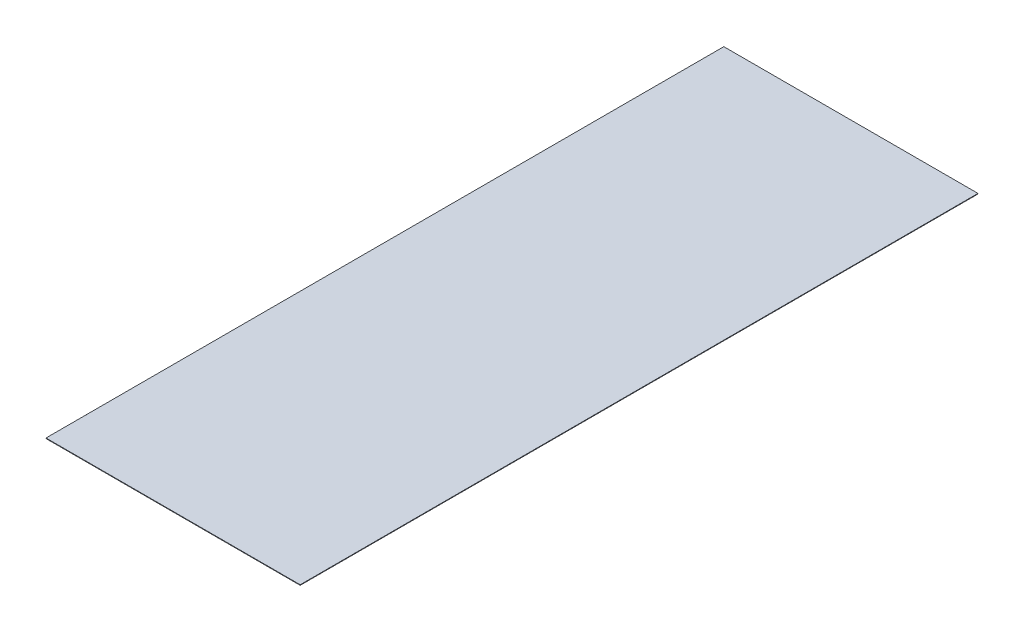
ISO-10303-21;
HEADER;
FILE_DESCRIPTION(('STEP AP214'),'2;1');
FILE_NAME('part.step','',(''),(''),'','','');
FILE_SCHEMA(('AUTOMOTIVE_DESIGN { 1 0 10303 214 1 1 1 1 }'));
ENDSEC;
DATA;
#1=APPLICATION_CONTEXT('core data for automotive mechanical design processes');
#2=APPLICATION_PROTOCOL_DEFINITION('international standard','automotive_design',2000,#1);
#3=PRODUCT_CONTEXT('',#1,'mechanical');
#4=PRODUCT('Part','Part','',(#3));
#5=PRODUCT_RELATED_PRODUCT_CATEGORY('part','',(#4));
#6=PRODUCT_DEFINITION_FORMATION('','',#4);
#7=PRODUCT_DEFINITION_CONTEXT('part definition',#1,'design');
#8=PRODUCT_DEFINITION('design','',#6,#7);
#9=PRODUCT_DEFINITION_SHAPE('','',#8);
#10=(LENGTH_UNIT() NAMED_UNIT(*) SI_UNIT(.MILLI.,.METRE.));
#11=(NAMED_UNIT(*) PLANE_ANGLE_UNIT() SI_UNIT($,.RADIAN.));
#12=(NAMED_UNIT(*) SI_UNIT($,.STERADIAN.) SOLID_ANGLE_UNIT());
#13=UNCERTAINTY_MEASURE_WITH_UNIT(LENGTH_MEASURE(1.E-05),#10,'distance_accuracy_value','');
#14=(GEOMETRIC_REPRESENTATION_CONTEXT(3) GLOBAL_UNCERTAINTY_ASSIGNED_CONTEXT((#13)) GLOBAL_UNIT_ASSIGNED_CONTEXT((#10,
#11,#12)) REPRESENTATION_CONTEXT('',''));
#15=CARTESIAN_POINT('',(0.,0.,0.));
#16=DIRECTION('',(0.,0.,1.));
#17=DIRECTION('',(1.,0.,0.));
#18=AXIS2_PLACEMENT_3D('',#15,#16,#17);
#19=CARTESIAN_POINT('',(457.2,1.9,1219.2));
#20=DIRECTION('',(-1.,0.,0.));
#21=DIRECTION('',(0.,0.,1.));
#22=AXIS2_PLACEMENT_3D('',#19,#20,#21);
#23=PLANE('',#22);
#24=DIRECTION('',(0.,0.,-1.));
#25=VECTOR('',#24,1.);
#26=CARTESIAN_POINT('',(457.2,0.,1219.2));
#27=LINE('',#26,#25);
#28=CARTESIAN_POINT('',(457.2,0.,1219.2));
#29=VERTEX_POINT('',#28);
#30=CARTESIAN_POINT('',(457.2,0.,-1219.2));
#31=VERTEX_POINT('',#30);
#32=EDGE_CURVE('E96',#29,#31,#27,.T.);
#33=ORIENTED_EDGE('',*,*,#32,.T.);
#34=DIRECTION('',(0.,-1.,0.));
#35=VECTOR('',#34,1.);
#36=CARTESIAN_POINT('',(457.2,1.9,-1219.2));
#37=LINE('',#36,#35);
#38=CARTESIAN_POINT('',(457.2,1.9,-1219.2));
#39=VERTEX_POINT('',#38);
#40=EDGE_CURVE('E11',#39,#31,#37,.T.);
#41=ORIENTED_EDGE('',*,*,#40,.F.);
#42=DIRECTION('',(0.,0.,-1.));
#43=VECTOR('',#42,1.);
#44=CARTESIAN_POINT('',(457.2,1.9,1219.2));
#45=LINE('',#44,#43);
#46=CARTESIAN_POINT('',(457.2,1.9,1219.2));
#47=VERTEX_POINT('',#46);
#48=EDGE_CURVE('E84',#47,#39,#45,.T.);
#49=ORIENTED_EDGE('',*,*,#48,.F.);
#50=DIRECTION('',(0.,-1.,0.));
#51=VECTOR('',#50,1.);
#52=CARTESIAN_POINT('',(457.2,1.9,1219.2));
#53=LINE('',#52,#51);
#54=EDGE_CURVE('E92',#47,#29,#53,.T.);
#55=ORIENTED_EDGE('',*,*,#54,.T.);
#56=EDGE_LOOP('',(#33,#41,#49,#55));
#57=FACE_BOUND('',#56,.T.);
#58=ADVANCED_FACE('F33',(#57),#23,.F.);
#59=CARTESIAN_POINT('',(-457.2,1.9,-1219.2));
#60=DIRECTION('',(0.,0.,1.));
#61=DIRECTION('',(1.,0.,0.));
#62=AXIS2_PLACEMENT_3D('',#59,#60,#61);
#63=PLANE('',#62);
#64=DIRECTION('',(-1.,0.,0.));
#65=VECTOR('',#64,1.);
#66=CARTESIAN_POINT('',(-457.2,0.,-1219.2));
#67=LINE('',#66,#65);
#68=CARTESIAN_POINT('',(-457.2,0.,-1219.2));
#69=VERTEX_POINT('',#68);
#70=EDGE_CURVE('E88',#31,#69,#67,.T.);
#71=ORIENTED_EDGE('',*,*,#70,.T.);
#72=DIRECTION('',(0.,-1.,0.));
#73=VECTOR('',#72,1.);
#74=CARTESIAN_POINT('',(-457.2,1.9,-1219.2));
#75=LINE('',#74,#73);
#76=CARTESIAN_POINT('',(-457.2,1.9,-1219.2));
#77=VERTEX_POINT('',#76);
#78=EDGE_CURVE('E41',#77,#69,#75,.T.);
#79=ORIENTED_EDGE('',*,*,#78,.F.);
#80=DIRECTION('',(-1.,0.,0.));
#81=VECTOR('',#80,1.);
#82=CARTESIAN_POINT('',(-457.2,1.9,-1219.2));
#83=LINE('',#82,#81);
#84=EDGE_CURVE('E79',#39,#77,#83,.T.);
#85=ORIENTED_EDGE('',*,*,#84,.F.);
#86=ORIENTED_EDGE('',*,*,#40,.T.);
#87=EDGE_LOOP('',(#71,#79,#85,#86));
#88=FACE_BOUND('',#87,.T.);
#89=ADVANCED_FACE('F87',(#88),#63,.F.);
#90=CARTESIAN_POINT('',(-457.2,1.9,1219.2));
#91=DIRECTION('',(1.,0.,0.));
#92=DIRECTION('',(0.,0.,-1.));
#93=AXIS2_PLACEMENT_3D('',#90,#91,#92);
#94=PLANE('',#93);
#95=DIRECTION('',(0.,0.,1.));
#96=VECTOR('',#95,1.);
#97=CARTESIAN_POINT('',(-457.2,0.,1219.2));
#98=LINE('',#97,#96);
#99=CARTESIAN_POINT('',(-457.2,0.,1219.2));
#100=VERTEX_POINT('',#99);
#101=EDGE_CURVE('E66',#69,#100,#98,.T.);
#102=ORIENTED_EDGE('',*,*,#101,.T.);
#103=DIRECTION('',(0.,-1.,0.));
#104=VECTOR('',#103,1.);
#105=CARTESIAN_POINT('',(-457.2,1.9,1219.2));
#106=LINE('',#105,#104);
#107=CARTESIAN_POINT('',(-457.2,1.9,1219.2));
#108=VERTEX_POINT('',#107);
#109=EDGE_CURVE('E89',#108,#100,#106,.T.);
#110=ORIENTED_EDGE('',*,*,#109,.F.);
#111=DIRECTION('',(0.,0.,1.));
#112=VECTOR('',#111,1.);
#113=CARTESIAN_POINT('',(-457.2,1.9,1219.2));
#114=LINE('',#113,#112);
#115=EDGE_CURVE('E82',#77,#108,#114,.T.);
#116=ORIENTED_EDGE('',*,*,#115,.F.);
#117=ORIENTED_EDGE('',*,*,#78,.T.);
#118=EDGE_LOOP('',(#102,#110,#116,#117));
#119=FACE_BOUND('',#118,.T.);
#120=ADVANCED_FACE('F90',(#119),#94,.F.);
#121=CARTESIAN_POINT('',(-457.2,1.9,1219.2));
#122=DIRECTION('',(0.,0.,-1.));
#123=DIRECTION('',(-1.,0.,0.));
#124=AXIS2_PLACEMENT_3D('',#121,#122,#123);
#125=PLANE('',#124);
#126=DIRECTION('',(1.,0.,0.));
#127=VECTOR('',#126,1.);
#128=CARTESIAN_POINT('',(-457.2,0.,1219.2));
#129=LINE('',#128,#127);
#130=EDGE_CURVE('E72',#100,#29,#129,.T.);
#131=ORIENTED_EDGE('',*,*,#130,.T.);
#132=ORIENTED_EDGE('',*,*,#54,.F.);
#133=DIRECTION('',(1.,0.,0.));
#134=VECTOR('',#133,1.);
#135=CARTESIAN_POINT('',(-457.2,1.9,1219.2));
#136=LINE('',#135,#134);
#137=EDGE_CURVE('E49',#108,#47,#136,.T.);
#138=ORIENTED_EDGE('',*,*,#137,.F.);
#139=ORIENTED_EDGE('',*,*,#109,.T.);
#140=EDGE_LOOP('',(#131,#132,#138,#139));
#141=FACE_BOUND('',#140,.T.);
#142=ADVANCED_FACE('F103',(#141),#125,.F.);
#143=CARTESIAN_POINT('',(0.,1.9,0.));
#144=DIRECTION('',(0.,-1.,0.));
#145=DIRECTION('',(0.,0.,-1.));
#146=AXIS2_PLACEMENT_3D('',#143,#144,#145);
#147=PLANE('',#146);
#148=ORIENTED_EDGE('',*,*,#48,.T.);
#149=ORIENTED_EDGE('',*,*,#84,.T.);
#150=ORIENTED_EDGE('',*,*,#115,.T.);
#151=ORIENTED_EDGE('',*,*,#137,.T.);
#152=EDGE_LOOP('',(#148,#149,#150,#151));
#153=FACE_BOUND('',#152,.T.);
#154=ADVANCED_FACE('F80',(#153),#147,.F.);
#155=CARTESIAN_POINT('',(0.,0.,0.));
#156=DIRECTION('',(0.,-1.,0.));
#157=DIRECTION('',(0.,0.,-1.));
#158=AXIS2_PLACEMENT_3D('',#155,#156,#157);
#159=PLANE('',#158);
#160=ORIENTED_EDGE('',*,*,#32,.F.);
#161=ORIENTED_EDGE('',*,*,#130,.F.);
#162=ORIENTED_EDGE('',*,*,#101,.F.);
#163=ORIENTED_EDGE('',*,*,#70,.F.);
#164=EDGE_LOOP('',(#160,#161,#162,#163));
#165=FACE_BOUND('',#164,.T.);
#166=ADVANCED_FACE('F106',(#165),#159,.T.);
#167=CLOSED_SHELL('',(#58,#89,#120,#142,#154,#166));
#168=MANIFOLD_SOLID_BREP('B2',#167);
#169=ADVANCED_BREP_SHAPE_REPRESENTATION('',(#18,#168),#14);
#170=SHAPE_DEFINITION_REPRESENTATION(#9,#169);
ENDSEC;
END-ISO-10303-21;
